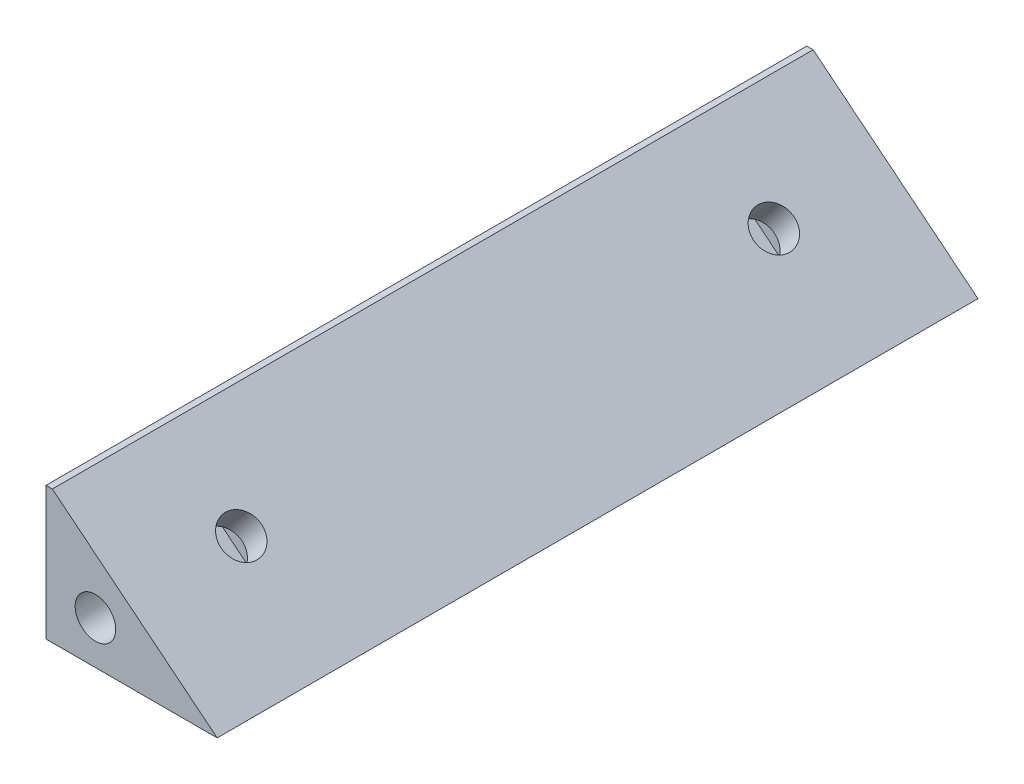
ISO-10303-21;
HEADER;
FILE_DESCRIPTION(('STEP AP214'),'2;1');
FILE_NAME('part.step','',(''),(''),'','','');
FILE_SCHEMA(('AUTOMOTIVE_DESIGN { 1 0 10303 214 1 1 1 1 }'));
ENDSEC;
DATA;
#1=APPLICATION_CONTEXT('core data for automotive mechanical design processes');
#2=APPLICATION_PROTOCOL_DEFINITION('international standard','automotive_design',2000,#1);
#3=PRODUCT_CONTEXT('',#1,'mechanical');
#4=PRODUCT('Part','Part','',(#3));
#5=PRODUCT_RELATED_PRODUCT_CATEGORY('part','',(#4));
#6=PRODUCT_DEFINITION_FORMATION('','',#4);
#7=PRODUCT_DEFINITION_CONTEXT('part definition',#1,'design');
#8=PRODUCT_DEFINITION('design','',#6,#7);
#9=PRODUCT_DEFINITION_SHAPE('','',#8);
#10=(LENGTH_UNIT() NAMED_UNIT(*) SI_UNIT(.MILLI.,.METRE.));
#11=(NAMED_UNIT(*) PLANE_ANGLE_UNIT() SI_UNIT($,.RADIAN.));
#12=(NAMED_UNIT(*) SI_UNIT($,.STERADIAN.) SOLID_ANGLE_UNIT());
#13=UNCERTAINTY_MEASURE_WITH_UNIT(LENGTH_MEASURE(1.E-05),#10,'distance_accuracy_value','');
#14=(GEOMETRIC_REPRESENTATION_CONTEXT(3) GLOBAL_UNCERTAINTY_ASSIGNED_CONTEXT((#13)) GLOBAL_UNIT_ASSIGNED_CONTEXT((#10,
#11,#12)) REPRESENTATION_CONTEXT('',''));
#15=CARTESIAN_POINT('',(0.,0.,0.));
#16=DIRECTION('',(0.,0.,1.));
#17=DIRECTION('',(1.,0.,0.));
#18=AXIS2_PLACEMENT_3D('',#15,#16,#17);
#19=CARTESIAN_POINT('',(3.59307184949746,4.44856514699686,0.));
#20=DIRECTION('',(0.628337107087621,0.777941180203721,0.));
#21=DIRECTION('',(-0.777941180203721,0.628337107087621,0.));
#22=AXIS2_PLACEMENT_3D('',#19,#20,#21);
#23=PLANE('',#22);
#24=CARTESIAN_POINT('',(4.35956280460536,3.82947629864048,9.));
#25=DIRECTION('',(0.628337107087621,0.777941180203721,0.));
#26=DIRECTION('',(-0.777941180203721,0.628337107087621,0.));
#27=AXIS2_PLACEMENT_3D('',#24,#25,#26);
#28=CIRCLE('',#27,1.6);
#29=CARTESIAN_POINT('',(3.11485691627941,4.83481566998067,9.));
#30=VERTEX_POINT('',#29);
#31=EDGE_CURVE('E419',#30,#30,#28,.T.);
#32=ORIENTED_EDGE('',*,*,#31,.T.);
#33=EDGE_LOOP('',(#32));
#34=FACE_BOUND('',#33,.T.);
#35=DIRECTION('',(0.777941180203722,-0.628337107087621,0.));
#36=VECTOR('',#35,1.);
#37=CARTESIAN_POINT('',(3.59307184949746,4.44856514699686,6.175));
#38=LINE('',#37,#36);
#39=CARTESIAN_POINT('',(3.09072945140817,4.85430323776128,6.175));
#40=VERTEX_POINT('',#39);
#41=CARTESIAN_POINT('',(9.10081917435071,0.,6.175));
#42=VERTEX_POINT('',#41);
#43=EDGE_CURVE('E415',#40,#42,#38,.T.);
#44=ORIENTED_EDGE('',*,*,#43,.T.);
#45=DIRECTION('',(0.,0.,1.));
#46=VECTOR('',#45,1.);
#47=CARTESIAN_POINT('',(9.10081917435071,0.,0.));
#48=LINE('',#47,#46);
#49=CARTESIAN_POINT('',(9.10081917435071,0.,11.825));
#50=VERTEX_POINT('',#49);
#51=EDGE_CURVE('E634',#42,#50,#48,.T.);
#52=ORIENTED_EDGE('',*,*,#51,.T.);
#53=DIRECTION('',(-0.777941180203721,0.628337107087621,0.));
#54=VECTOR('',#53,1.);
#55=CARTESIAN_POINT('',(3.59307184949746,4.44856514699686,11.825));
#56=LINE('',#55,#54);
#57=CARTESIAN_POINT('',(3.09072945140817,4.85430323776128,11.825));
#58=VERTEX_POINT('',#57);
#59=EDGE_CURVE('E430',#50,#58,#56,.T.);
#60=ORIENTED_EDGE('',*,*,#59,.T.);
#61=DIRECTION('',(-0.388970590101861,0.314168553543811,-0.866025403784439));
#62=VECTOR('',#61,1.);
#63=CARTESIAN_POINT('',(-0.767035675146511,7.97019045536314,3.23586065001688));
#64=LINE('',#63,#62);
#65=CARTESIAN_POINT('',(1.82189609821099,5.87913017688208,9.));
#66=VERTEX_POINT('',#65);
#67=EDGE_CURVE('E423',#58,#66,#64,.T.);
#68=ORIENTED_EDGE('',*,*,#67,.T.);
#69=DIRECTION('',(0.388970590101861,-0.314168553543811,-0.866025403784439));
#70=VECTOR('',#69,1.);
#71=CARTESIAN_POINT('',(5.29641574721172,3.07278738345842,1.26413934998312));
#72=LINE('',#71,#70);
#73=EDGE_CURVE('E493',#66,#40,#72,.T.);
#74=ORIENTED_EDGE('',*,*,#73,.T.);
#75=EDGE_LOOP('',(#44,#52,#60,#68,#74));
#76=FACE_BOUND('',#75,.T.);
#77=ADVANCED_FACE('F135',(#34,#76),#23,.F.);
#78=CARTESIAN_POINT('',(0.,0.,30.));
#79=DIRECTION('',(0.,1.,0.));
#80=DIRECTION('',(-1.,0.,0.));
#81=AXIS2_PLACEMENT_3D('',#78,#79,#80);
#82=PLANE('',#81);
#83=DIRECTION('',(1.,0.,0.));
#84=VECTOR('',#83,1.);
#85=CARTESIAN_POINT('',(0.,0.,0.));
#86=LINE('',#85,#84);
#87=CARTESIAN_POINT('',(-0.5,0.,0.));
#88=VERTEX_POINT('',#87);
#89=CARTESIAN_POINT('',(13.,0.,0.));
#90=VERTEX_POINT('',#89);
#91=EDGE_CURVE('E329',#88,#90,#86,.T.);
#92=ORIENTED_EDGE('',*,*,#91,.T.);
#93=DIRECTION('',(0.,0.,-1.));
#94=VECTOR('',#93,1.);
#95=CARTESIAN_POINT('',(13.,0.,30.));
#96=LINE('',#95,#94);
#97=CARTESIAN_POINT('',(13.,0.,60.));
#98=VERTEX_POINT('',#97);
#99=EDGE_CURVE('E327',#98,#90,#96,.T.);
#100=ORIENTED_EDGE('',*,*,#99,.F.);
#101=DIRECTION('',(1.,0.,0.));
#102=VECTOR('',#101,1.);
#103=CARTESIAN_POINT('',(0.,0.,60.));
#104=LINE('',#103,#102);
#105=CARTESIAN_POINT('',(-0.5,0.,60.));
#106=VERTEX_POINT('',#105);
#107=EDGE_CURVE('E311',#106,#98,#104,.T.);
#108=ORIENTED_EDGE('',*,*,#107,.F.);
#109=DIRECTION('',(0.,0.,-1.));
#110=VECTOR('',#109,1.);
#111=CARTESIAN_POINT('',(-0.5,0.,30.));
#112=LINE('',#111,#110);
#113=EDGE_CURVE('E481',#106,#88,#112,.T.);
#114=ORIENTED_EDGE('',*,*,#113,.T.);
#115=EDGE_LOOP('',(#92,#100,#108,#114));
#116=FACE_BOUND('',#115,.T.);
#117=DIRECTION('',(1.,0.,0.));
#118=VECTOR('',#117,1.);
#119=CARTESIAN_POINT('',(0.,0.,11.825));
#120=LINE('',#119,#118);
#121=CARTESIAN_POINT('',(5.04248811091981,0.,11.825));
#122=VERTEX_POINT('',#121);
#123=EDGE_CURVE('E455',#122,#50,#120,.T.);
#124=ORIENTED_EDGE('',*,*,#123,.T.);
#125=ORIENTED_EDGE('',*,*,#51,.F.);
#126=DIRECTION('',(1.,0.,0.));
#127=VECTOR('',#126,1.);
#128=CARTESIAN_POINT('',(0.,0.,6.175));
#129=LINE('',#128,#127);
#130=CARTESIAN_POINT('',(5.04248811091981,0.,6.175));
#131=VERTEX_POINT('',#130);
#132=EDGE_CURVE('E466',#131,#42,#129,.T.);
#133=ORIENTED_EDGE('',*,*,#132,.F.);
#134=DIRECTION('',(0.,0.,-1.));
#135=VECTOR('',#134,1.);
#136=CARTESIAN_POINT('',(5.04248811091981,0.,30.));
#137=LINE('',#136,#135);
#138=EDGE_CURVE('E333',#122,#131,#137,.T.);
#139=ORIENTED_EDGE('',*,*,#138,.F.);
#140=EDGE_LOOP('',(#124,#125,#133,#139));
#141=FACE_BOUND('',#140,.T.);
#142=CARTESIAN_POINT('',(9.10081917435071,0.,48.175));
#143=VERTEX_POINT('',#142);
#144=CARTESIAN_POINT('',(9.10081917435071,0.,53.825));
#145=VERTEX_POINT('',#144);
#146=EDGE_CURVE('E523',#143,#145,#48,.T.);
#147=ORIENTED_EDGE('',*,*,#146,.F.);
#148=DIRECTION('',(1.,0.,0.));
#149=VECTOR('',#148,1.);
#150=CARTESIAN_POINT('',(0.,0.,48.175));
#151=LINE('',#150,#149);
#152=CARTESIAN_POINT('',(5.04248811091981,0.,48.175));
#153=VERTEX_POINT('',#152);
#154=EDGE_CURVE('E516',#153,#143,#151,.T.);
#155=ORIENTED_EDGE('',*,*,#154,.F.);
#156=DIRECTION('',(0.,0.,-1.));
#157=VECTOR('',#156,1.);
#158=CARTESIAN_POINT('',(5.04248811091981,0.,30.));
#159=LINE('',#158,#157);
#160=CARTESIAN_POINT('',(5.04248811091981,0.,53.825));
#161=VERTEX_POINT('',#160);
#162=EDGE_CURVE('E144',#161,#153,#159,.T.);
#163=ORIENTED_EDGE('',*,*,#162,.F.);
#164=DIRECTION('',(1.,0.,0.));
#165=VECTOR('',#164,1.);
#166=CARTESIAN_POINT('',(0.,0.,53.825));
#167=LINE('',#166,#165);
#168=EDGE_CURVE('E526',#161,#145,#167,.T.);
#169=ORIENTED_EDGE('',*,*,#168,.T.);
#170=EDGE_LOOP('',(#147,#155,#163,#169));
#171=FACE_BOUND('',#170,.T.);
#172=DIRECTION('',(0.,0.,-1.));
#173=VECTOR('',#172,1.);
#174=CARTESIAN_POINT('',(9.15,0.,5.));
#175=LINE('',#174,#173);
#176=CARTESIAN_POINT('',(9.15,0.,5.));
#177=VERTEX_POINT('',#176);
#178=CARTESIAN_POINT('',(9.15,0.,2.45));
#179=VERTEX_POINT('',#178);
#180=EDGE_CURVE('E406',#177,#179,#175,.T.);
#181=ORIENTED_EDGE('',*,*,#180,.T.);
#182=DIRECTION('',(1.,0.,0.));
#183=VECTOR('',#182,1.);
#184=CARTESIAN_POINT('',(0.,0.,2.45));
#185=LINE('',#184,#183);
#186=CARTESIAN_POINT('',(3.11352959219352,0.,2.45));
#187=VERTEX_POINT('',#186);
#188=EDGE_CURVE('E355',#187,#179,#185,.T.);
#189=ORIENTED_EDGE('',*,*,#188,.F.);
#190=DIRECTION('',(0.,0.,-1.));
#191=VECTOR('',#190,1.);
#192=CARTESIAN_POINT('',(3.11352959219352,0.,5.));
#193=LINE('',#192,#191);
#194=CARTESIAN_POINT('',(3.11352959219352,0.,5.));
#195=VERTEX_POINT('',#194);
#196=EDGE_CURVE('E410',#195,#187,#193,.T.);
#197=ORIENTED_EDGE('',*,*,#196,.F.);
#198=DIRECTION('',(1.,0.,0.));
#199=VECTOR('',#198,1.);
#200=CARTESIAN_POINT('',(0.,0.,5.));
#201=LINE('',#200,#199);
#202=EDGE_CURVE('E374',#195,#177,#201,.T.);
#203=ORIENTED_EDGE('',*,*,#202,.T.);
#204=EDGE_LOOP('',(#181,#189,#197,#203));
#205=FACE_BOUND('',#204,.T.);
#206=DIRECTION('',(1.,0.,0.));
#207=VECTOR('',#206,1.);
#208=CARTESIAN_POINT('',(0.,0.,55.));
#209=LINE('',#208,#207);
#210=CARTESIAN_POINT('',(3.11352959219352,0.,55.));
#211=VERTEX_POINT('',#210);
#212=CARTESIAN_POINT('',(9.15,0.,55.));
#213=VERTEX_POINT('',#212);
#214=EDGE_CURVE('E683',#211,#213,#209,.T.);
#215=ORIENTED_EDGE('',*,*,#214,.F.);
#216=DIRECTION('',(0.,0.,1.));
#217=VECTOR('',#216,1.);
#218=CARTESIAN_POINT('',(3.11352959219352,0.,55.));
#219=LINE('',#218,#217);
#220=CARTESIAN_POINT('',(3.11352959219352,0.,57.55));
#221=VERTEX_POINT('',#220);
#222=EDGE_CURVE('E687',#211,#221,#219,.T.);
#223=ORIENTED_EDGE('',*,*,#222,.T.);
#224=DIRECTION('',(1.,0.,0.));
#225=VECTOR('',#224,1.);
#226=CARTESIAN_POINT('',(0.,0.,57.55));
#227=LINE('',#226,#225);
#228=CARTESIAN_POINT('',(9.15,0.,57.55));
#229=VERTEX_POINT('',#228);
#230=EDGE_CURVE('E656',#221,#229,#227,.T.);
#231=ORIENTED_EDGE('',*,*,#230,.T.);
#232=DIRECTION('',(0.,0.,1.));
#233=VECTOR('',#232,1.);
#234=CARTESIAN_POINT('',(9.15,0.,55.));
#235=LINE('',#234,#233);
#236=EDGE_CURVE('E690',#213,#229,#235,.T.);
#237=ORIENTED_EDGE('',*,*,#236,.F.);
#238=EDGE_LOOP('',(#215,#223,#231,#237));
#239=FACE_BOUND('',#238,.T.);
#240=ADVANCED_FACE('F137',(#116,#141,#171,#205,#239),#82,.F.);
#241=CARTESIAN_POINT('',(1.99081222642403,2.46481513747737,48.175));
#242=DIRECTION('',(0.,0.,1.));
#243=DIRECTION('',(1.,0.,0.));
#244=AXIS2_PLACEMENT_3D('',#241,#242,#243);
#245=PLANE('',#244);
#246=ORIENTED_EDGE('',*,*,#154,.T.);
#247=DIRECTION('',(-0.777941180203721,0.628337107087621,0.));
#248=VECTOR('',#247,1.);
#249=CARTESIAN_POINT('',(3.59307184949746,4.44856514699686,48.175));
#250=LINE('',#249,#248);
#251=CARTESIAN_POINT('',(3.09072945140818,4.85430323776128,48.175));
#252=VERTEX_POINT('',#251);
#253=EDGE_CURVE('E586',#143,#252,#250,.T.);
#254=ORIENTED_EDGE('',*,*,#253,.T.);
#255=DIRECTION('',(0.628337107087621,0.777941180203721,0.));
#256=VECTOR('',#255,1.);
#257=CARTESIAN_POINT('',(1.48846982833474,2.87055322824179,48.175));
#258=LINE('',#257,#256);
#259=CARTESIAN_POINT('',(1.48846982833474,2.87055322824179,48.175));
#260=VERTEX_POINT('',#259);
#261=EDGE_CURVE('E518',#260,#252,#258,.T.);
#262=ORIENTED_EDGE('',*,*,#261,.F.);
#263=DIRECTION('',(0.777941180203721,-0.628337107087621,0.));
#264=VECTOR('',#263,1.);
#265=CARTESIAN_POINT('',(1.99081222642403,2.46481513747737,48.175));
#266=LINE('',#265,#264);
#267=EDGE_CURVE('E503',#260,#153,#266,.T.);
#268=ORIENTED_EDGE('',*,*,#267,.T.);
#269=EDGE_LOOP('',(#246,#254,#262,#268));
#270=FACE_BOUND('',#269,.T.);
#271=ADVANCED_FACE('F514',(#270),#245,.T.);
#272=CARTESIAN_POINT('',(1.99081222642403,2.46481513747737,53.825));
#273=DIRECTION('',(0.,0.,1.));
#274=DIRECTION('',(1.,0.,0.));
#275=AXIS2_PLACEMENT_3D('',#272,#273,#274);
#276=PLANE('',#275);
#277=DIRECTION('',(-0.777941180203721,0.628337107087621,0.));
#278=VECTOR('',#277,1.);
#279=CARTESIAN_POINT('',(3.59307184949746,4.44856514699686,53.825));
#280=LINE('',#279,#278);
#281=CARTESIAN_POINT('',(3.09072945140817,4.85430323776128,53.825));
#282=VERTEX_POINT('',#281);
#283=EDGE_CURVE('E598',#145,#282,#280,.T.);
#284=ORIENTED_EDGE('',*,*,#283,.F.);
#285=ORIENTED_EDGE('',*,*,#168,.F.);
#286=DIRECTION('',(0.777941180203722,-0.628337107087621,0.));
#287=VECTOR('',#286,1.);
#288=CARTESIAN_POINT('',(1.99081222642403,2.46481513747737,53.825));
#289=LINE('',#288,#287);
#290=CARTESIAN_POINT('',(1.48846982833474,2.87055322824179,53.825));
#291=VERTEX_POINT('',#290);
#292=EDGE_CURVE('E507',#291,#161,#289,.T.);
#293=ORIENTED_EDGE('',*,*,#292,.F.);
#294=DIRECTION('',(0.628337107087621,0.777941180203721,0.));
#295=VECTOR('',#294,1.);
#296=CARTESIAN_POINT('',(1.48846982833474,2.87055322824179,53.825));
#297=LINE('',#296,#295);
#298=EDGE_CURVE('E620',#291,#282,#297,.T.);
#299=ORIENTED_EDGE('',*,*,#298,.T.);
#300=EDGE_LOOP('',(#284,#285,#293,#299));
#301=FACE_BOUND('',#300,.T.);
#302=ADVANCED_FACE('F632',(#301),#276,.F.);
#303=CARTESIAN_POINT('',(-2.36929529821995,5.98644044584365,56.7641393499831));
#304=DIRECTION('',(0.673716824706471,-0.544155896878303,0.5));
#305=DIRECTION('',(0.628337107087621,0.777941180203721,0.));
#306=AXIS2_PLACEMENT_3D('',#303,#304,#305);
#307=PLANE('',#306);
#308=ORIENTED_EDGE('',*,*,#261,.T.);
#309=DIRECTION('',(-0.388970590101861,0.314168553543811,0.866025403784439));
#310=VECTOR('',#309,1.);
#311=CARTESIAN_POINT('',(-0.767035675146511,7.97019045536314,56.7641393499831));
#312=LINE('',#311,#310);
#313=CARTESIAN_POINT('',(1.82189609821098,5.87913017688209,51.));
#314=VERTEX_POINT('',#313);
#315=EDGE_CURVE('E592',#252,#314,#312,.T.);
#316=ORIENTED_EDGE('',*,*,#315,.T.);
#317=DIRECTION('',(0.628337107087621,0.777941180203721,0.));
#318=VECTOR('',#317,1.);
#319=CARTESIAN_POINT('',(0.219636475137554,3.8953801673626,51.));
#320=LINE('',#319,#318);
#321=CARTESIAN_POINT('',(0.219636475137554,3.8953801673626,51.));
#322=VERTEX_POINT('',#321);
#323=EDGE_CURVE('E520',#322,#314,#320,.T.);
#324=ORIENTED_EDGE('',*,*,#323,.F.);
#325=DIRECTION('',(0.388970590101861,-0.314168553543811,-0.866025403784439));
#326=VECTOR('',#325,1.);
#327=CARTESIAN_POINT('',(-2.36929529821995,5.98644044584365,56.7641393499831));
#328=LINE('',#327,#326);
#329=EDGE_CURVE('E610',#322,#260,#328,.T.);
#330=ORIENTED_EDGE('',*,*,#329,.T.);
#331=EDGE_LOOP('',(#308,#316,#324,#330));
#332=FACE_BOUND('',#331,.T.);
#333=ADVANCED_FACE('F629',(#332),#307,.T.);
#334=CARTESIAN_POINT('',(3.69415612413829,1.08903737393893,58.7358606500169));
#335=DIRECTION('',(0.673716824706471,-0.544155896878303,-0.5));
#336=DIRECTION('',(0.628337107087621,0.777941180203721,0.));
#337=AXIS2_PLACEMENT_3D('',#334,#335,#336);
#338=PLANE('',#337);
#339=ORIENTED_EDGE('',*,*,#323,.T.);
#340=DIRECTION('',(0.388970590101861,-0.314168553543811,0.866025403784439));
#341=VECTOR('',#340,1.);
#342=CARTESIAN_POINT('',(5.29641574721172,3.07278738345842,58.7358606500169));
#343=LINE('',#342,#341);
#344=EDGE_CURVE('E12',#314,#282,#343,.T.);
#345=ORIENTED_EDGE('',*,*,#344,.T.);
#346=ORIENTED_EDGE('',*,*,#298,.F.);
#347=DIRECTION('',(-0.388970590101861,0.314168553543811,-0.866025403784439));
#348=VECTOR('',#347,1.);
#349=CARTESIAN_POINT('',(3.69415612413829,1.08903737393893,58.7358606500169));
#350=LINE('',#349,#348);
#351=EDGE_CURVE('E613',#291,#322,#350,.T.);
#352=ORIENTED_EDGE('',*,*,#351,.T.);
#353=EDGE_LOOP('',(#339,#345,#346,#352));
#354=FACE_BOUND('',#353,.T.);
#355=ADVANCED_FACE('F627',(#354),#338,.T.);
#356=CARTESIAN_POINT('',(5.13249776186213,6.35452103849597,30.));
#357=DIRECTION('',(0.628337107087621,0.777941180203721,0.));
#358=DIRECTION('',(-0.777941180203721,0.628337107087621,0.));
#359=AXIS2_PLACEMENT_3D('',#356,#357,#358);
#360=PLANE('',#359);
#361=DIRECTION('',(0.777941180203721,-0.628337107087621,0.));
#362=VECTOR('',#361,1.);
#363=CARTESIAN_POINT('',(5.13249776186213,6.35452103849597,60.));
#364=LINE('',#363,#362);
#365=CARTESIAN_POINT('',(0.,10.5,60.));
#366=VERTEX_POINT('',#365);
#367=EDGE_CURVE('E317',#366,#98,#364,.T.);
#368=ORIENTED_EDGE('',*,*,#367,.T.);
#369=ORIENTED_EDGE('',*,*,#99,.T.);
#370=DIRECTION('',(0.777941180203721,-0.628337107087621,0.));
#371=VECTOR('',#370,1.);
#372=CARTESIAN_POINT('',(5.13249776186213,6.35452103849597,0.));
#373=LINE('',#372,#371);
#374=CARTESIAN_POINT('',(0.,10.5,0.));
#375=VERTEX_POINT('',#374);
#376=EDGE_CURVE('E486',#375,#90,#373,.T.);
#377=ORIENTED_EDGE('',*,*,#376,.F.);
#378=DIRECTION('',(0.,0.,-1.));
#379=VECTOR('',#378,1.);
#380=CARTESIAN_POINT('',(0.,10.5,30.));
#381=LINE('',#380,#379);
#382=EDGE_CURVE('E334',#366,#375,#381,.T.);
#383=ORIENTED_EDGE('',*,*,#382,.F.);
#384=EDGE_LOOP('',(#368,#369,#377,#383));
#385=FACE_BOUND('',#384,.T.);
#386=CARTESIAN_POINT('',(5.89898871697003,5.7354321901396,9.));
#387=DIRECTION('',(0.628337107087621,0.777941180203721,0.));
#388=DIRECTION('',(-0.777941180203721,0.628337107087621,0.));
#389=AXIS2_PLACEMENT_3D('',#386,#387,#388);
#390=CIRCLE('',#389,1.6);
#391=CARTESIAN_POINT('',(4.65428282864408,6.74077156147979,9.));
#392=VERTEX_POINT('',#391);
#393=EDGE_CURVE('E414',#392,#392,#390,.T.);
#394=ORIENTED_EDGE('',*,*,#393,.F.);
#395=EDGE_LOOP('',(#394));
#396=FACE_BOUND('',#395,.T.);
#397=CARTESIAN_POINT('',(5.89898871697003,5.7354321901396,51.));
#398=DIRECTION('',(-0.628337107087621,-0.777941180203721,0.));
#399=DIRECTION('',(-0.777941180203721,0.628337107087621,0.));
#400=AXIS2_PLACEMENT_3D('',#397,#398,#399);
#401=CIRCLE('',#400,1.6);
#402=CARTESIAN_POINT('',(4.65428282864408,6.74077156147979,51.));
#403=VERTEX_POINT('',#402);
#404=EDGE_CURVE('E593',#403,#403,#401,.T.);
#405=ORIENTED_EDGE('',*,*,#404,.T.);
#406=EDGE_LOOP('',(#405));
#407=FACE_BOUND('',#406,.T.);
#408=ADVANCED_FACE('F336',(#385,#396,#407),#360,.T.);
#409=CARTESIAN_POINT('',(0.,0.,0.));
#410=DIRECTION('',(0.,0.,1.));
#411=DIRECTION('',(1.,0.,0.));
#412=AXIS2_PLACEMENT_3D('',#409,#410,#411);
#413=PLANE('',#412);
#414=ORIENTED_EDGE('',*,*,#376,.T.);
#415=ORIENTED_EDGE('',*,*,#91,.F.);
#416=DIRECTION('',(0.,1.,0.));
#417=VECTOR('',#416,1.);
#418=CARTESIAN_POINT('',(-0.5,0.,0.));
#419=LINE('',#418,#417);
#420=CARTESIAN_POINT('',(-0.5,10.5,0.));
#421=VERTEX_POINT('',#420);
#422=EDGE_CURVE('E470',#88,#421,#419,.T.);
#423=ORIENTED_EDGE('',*,*,#422,.T.);
#424=DIRECTION('',(-1.,0.,0.));
#425=VECTOR('',#424,1.);
#426=CARTESIAN_POINT('',(0.,10.5,0.));
#427=LINE('',#426,#425);
#428=EDGE_CURVE('E474',#375,#421,#427,.T.);
#429=ORIENTED_EDGE('',*,*,#428,.F.);
#430=EDGE_LOOP('',(#414,#415,#423,#429));
#431=FACE_BOUND('',#430,.T.);
#432=CARTESIAN_POINT('',(3.4,3.4,0.));
#433=DIRECTION('',(0.,0.,1.));
#434=DIRECTION('',(1.,0.,0.));
#435=AXIS2_PLACEMENT_3D('',#432,#433,#434);
#436=CIRCLE('',#435,1.6);
#437=CARTESIAN_POINT('',(5.,3.4,0.));
#438=VERTEX_POINT('',#437);
#439=EDGE_CURVE('E340',#438,#438,#436,.T.);
#440=ORIENTED_EDGE('',*,*,#439,.T.);
#441=EDGE_LOOP('',(#440));
#442=FACE_BOUND('',#441,.T.);
#443=ADVANCED_FACE('F541',(#431,#442),#413,.F.);
#444=CARTESIAN_POINT('',(1.99081222642403,2.46481513747737,6.175));
#445=DIRECTION('',(0.,0.,1.));
#446=DIRECTION('',(1.,0.,0.));
#447=AXIS2_PLACEMENT_3D('',#444,#445,#446);
#448=PLANE('',#447);
#449=ORIENTED_EDGE('',*,*,#132,.T.);
#450=ORIENTED_EDGE('',*,*,#43,.F.);
#451=DIRECTION('',(0.628337107087621,0.777941180203721,0.));
#452=VECTOR('',#451,1.);
#453=CARTESIAN_POINT('',(1.48846982833474,2.87055322824179,6.175));
#454=LINE('',#453,#452);
#455=CARTESIAN_POINT('',(1.48846982833474,2.87055322824179,6.175));
#456=VERTEX_POINT('',#455);
#457=EDGE_CURVE('E456',#456,#40,#454,.T.);
#458=ORIENTED_EDGE('',*,*,#457,.F.);
#459=DIRECTION('',(0.777941180203722,-0.628337107087621,0.));
#460=VECTOR('',#459,1.);
#461=CARTESIAN_POINT('',(1.99081222642403,2.46481513747737,6.175));
#462=LINE('',#461,#460);
#463=EDGE_CURVE('E442',#456,#131,#462,.T.);
#464=ORIENTED_EDGE('',*,*,#463,.T.);
#465=EDGE_LOOP('',(#449,#450,#458,#464));
#466=FACE_BOUND('',#465,.T.);
#467=ADVANCED_FACE('F544',(#466),#448,.T.);
#468=CARTESIAN_POINT('',(1.99081222642403,2.46481513747737,11.825));
#469=DIRECTION('',(0.,0.,1.));
#470=DIRECTION('',(1.,0.,0.));
#471=AXIS2_PLACEMENT_3D('',#468,#469,#470);
#472=PLANE('',#471);
#473=ORIENTED_EDGE('',*,*,#59,.F.);
#474=ORIENTED_EDGE('',*,*,#123,.F.);
#475=DIRECTION('',(0.777941180203721,-0.628337107087621,0.));
#476=VECTOR('',#475,1.);
#477=CARTESIAN_POINT('',(1.99081222642403,2.46481513747737,11.825));
#478=LINE('',#477,#476);
#479=CARTESIAN_POINT('',(1.48846982833474,2.87055322824179,11.825));
#480=VERTEX_POINT('',#479);
#481=EDGE_CURVE('E438',#480,#122,#478,.T.);
#482=ORIENTED_EDGE('',*,*,#481,.F.);
#483=DIRECTION('',(0.628337107087621,0.777941180203721,0.));
#484=VECTOR('',#483,1.);
#485=CARTESIAN_POINT('',(1.48846982833474,2.87055322824179,11.825));
#486=LINE('',#485,#484);
#487=EDGE_CURVE('E450',#480,#58,#486,.T.);
#488=ORIENTED_EDGE('',*,*,#487,.T.);
#489=EDGE_LOOP('',(#473,#474,#482,#488));
#490=FACE_BOUND('',#489,.T.);
#491=ADVANCED_FACE('F881',(#490),#472,.F.);
#492=CARTESIAN_POINT('',(-2.36929529821995,5.98644044584365,3.23586065001688));
#493=DIRECTION('',(-0.673716824706471,0.544155896878303,0.5));
#494=DIRECTION('',(-0.628337107087621,-0.777941180203721,0.));
#495=AXIS2_PLACEMENT_3D('',#492,#493,#494);
#496=PLANE('',#495);
#497=ORIENTED_EDGE('',*,*,#67,.F.);
#498=ORIENTED_EDGE('',*,*,#487,.F.);
#499=DIRECTION('',(0.388970590101861,-0.314168553543811,0.866025403784439));
#500=VECTOR('',#499,1.);
#501=CARTESIAN_POINT('',(-2.36929529821995,5.98644044584365,3.23586065001688));
#502=LINE('',#501,#500);
#503=CARTESIAN_POINT('',(0.219636475137554,3.8953801673626,9.));
#504=VERTEX_POINT('',#503);
#505=EDGE_CURVE('E434',#504,#480,#502,.T.);
#506=ORIENTED_EDGE('',*,*,#505,.F.);
#507=DIRECTION('',(0.628337107087621,0.777941180203721,0.));
#508=VECTOR('',#507,1.);
#509=CARTESIAN_POINT('',(0.219636475137554,3.8953801673626,9.));
#510=LINE('',#509,#508);
#511=EDGE_CURVE('E451',#504,#66,#510,.T.);
#512=ORIENTED_EDGE('',*,*,#511,.T.);
#513=EDGE_LOOP('',(#497,#498,#506,#512));
#514=FACE_BOUND('',#513,.T.);
#515=ADVANCED_FACE('F891',(#514),#496,.F.);
#516=CARTESIAN_POINT('',(3.69415612413829,1.08903737393893,1.26413934998312));
#517=DIRECTION('',(-0.673716824706471,0.544155896878303,-0.5));
#518=DIRECTION('',(-0.628337107087621,-0.777941180203721,0.));
#519=AXIS2_PLACEMENT_3D('',#516,#517,#518);
#520=PLANE('',#519);
#521=ORIENTED_EDGE('',*,*,#73,.F.);
#522=ORIENTED_EDGE('',*,*,#511,.F.);
#523=DIRECTION('',(-0.388970590101861,0.314168553543811,0.866025403784439));
#524=VECTOR('',#523,1.);
#525=CARTESIAN_POINT('',(3.69415612413829,1.08903737393893,1.26413934998312));
#526=LINE('',#525,#524);
#527=EDGE_CURVE('E446',#456,#504,#526,.T.);
#528=ORIENTED_EDGE('',*,*,#527,.F.);
#529=ORIENTED_EDGE('',*,*,#457,.T.);
#530=EDGE_LOOP('',(#521,#522,#528,#529));
#531=FACE_BOUND('',#530,.T.);
#532=ADVANCED_FACE('F1115',(#531),#520,.F.);
#533=CARTESIAN_POINT('',(-0.5,0.,30.));
#534=DIRECTION('',(-1.,0.,0.));
#535=DIRECTION('',(0.,0.,1.));
#536=AXIS2_PLACEMENT_3D('',#533,#534,#535);
#537=PLANE('',#536);
#538=ORIENTED_EDGE('',*,*,#422,.F.);
#539=ORIENTED_EDGE('',*,*,#113,.F.);
#540=DIRECTION('',(0.,1.,0.));
#541=VECTOR('',#540,1.);
#542=CARTESIAN_POINT('',(-0.5,0.,60.));
#543=LINE('',#542,#541);
#544=CARTESIAN_POINT('',(-0.5,10.5,60.));
#545=VERTEX_POINT('',#544);
#546=EDGE_CURVE('E320',#106,#545,#543,.T.);
#547=ORIENTED_EDGE('',*,*,#546,.T.);
#548=DIRECTION('',(0.,0.,-1.));
#549=VECTOR('',#548,1.);
#550=CARTESIAN_POINT('',(-0.5,10.5,30.));
#551=LINE('',#550,#549);
#552=EDGE_CURVE('E478',#545,#421,#551,.T.);
#553=ORIENTED_EDGE('',*,*,#552,.T.);
#554=EDGE_LOOP('',(#538,#539,#547,#553));
#555=FACE_BOUND('',#554,.T.);
#556=ADVANCED_FACE('F539',(#555),#537,.T.);
#557=CARTESIAN_POINT('',(0.,10.5,30.));
#558=DIRECTION('',(0.,-1.,0.));
#559=DIRECTION('',(0.,0.,-1.));
#560=AXIS2_PLACEMENT_3D('',#557,#558,#559);
#561=PLANE('',#560);
#562=ORIENTED_EDGE('',*,*,#428,.T.);
#563=ORIENTED_EDGE('',*,*,#552,.F.);
#564=DIRECTION('',(-1.,0.,0.));
#565=VECTOR('',#564,1.);
#566=CARTESIAN_POINT('',(0.,10.5,60.));
#567=LINE('',#566,#565);
#568=EDGE_CURVE('E324',#366,#545,#567,.T.);
#569=ORIENTED_EDGE('',*,*,#568,.F.);
#570=ORIENTED_EDGE('',*,*,#382,.T.);
#571=EDGE_LOOP('',(#562,#563,#569,#570));
#572=FACE_BOUND('',#571,.T.);
#573=ADVANCED_FACE('F535',(#572),#561,.F.);
#574=CARTESIAN_POINT('',(1.99081222642403,2.46481513747737,0.));
#575=DIRECTION('',(0.628337107087621,0.777941180203721,0.));
#576=DIRECTION('',(-0.777941180203721,0.628337107087621,0.));
#577=AXIS2_PLACEMENT_3D('',#574,#575,#576);
#578=PLANE('',#577);
#579=ORIENTED_EDGE('',*,*,#138,.T.);
#580=ORIENTED_EDGE('',*,*,#463,.F.);
#581=ORIENTED_EDGE('',*,*,#527,.T.);
#582=ORIENTED_EDGE('',*,*,#505,.T.);
#583=ORIENTED_EDGE('',*,*,#481,.T.);
#584=EDGE_LOOP('',(#579,#580,#581,#582,#583));
#585=FACE_BOUND('',#584,.T.);
#586=ADVANCED_FACE('F575',(#585),#578,.T.);
#587=ORIENTED_EDGE('',*,*,#253,.F.);
#588=ORIENTED_EDGE('',*,*,#146,.T.);
#589=ORIENTED_EDGE('',*,*,#283,.T.);
#590=ORIENTED_EDGE('',*,*,#344,.F.);
#591=ORIENTED_EDGE('',*,*,#315,.F.);
#592=EDGE_LOOP('',(#587,#588,#589,#590,#591));
#593=FACE_BOUND('',#592,.T.);
#594=CARTESIAN_POINT('',(4.35956280460536,3.82947629864048,51.));
#595=DIRECTION('',(-0.628337107087621,-0.777941180203721,0.));
#596=DIRECTION('',(-0.777941180203721,0.628337107087621,0.));
#597=AXIS2_PLACEMENT_3D('',#594,#595,#596);
#598=CIRCLE('',#597,1.6);
#599=CARTESIAN_POINT('',(3.11485691627941,4.83481566998067,51.));
#600=VERTEX_POINT('',#599);
#601=EDGE_CURVE('E589',#600,#600,#598,.T.);
#602=ORIENTED_EDGE('',*,*,#601,.F.);
#603=EDGE_LOOP('',(#602));
#604=FACE_BOUND('',#603,.T.);
#605=ADVANCED_FACE('F566',(#593,#604),#23,.F.);
#606=CARTESIAN_POINT('',(4.35956280460536,3.82947629864048,9.));
#607=DIRECTION('',(0.628337107087621,0.777941180203722,0.));
#608=DIRECTION('',(-0.777941180203721,0.628337107087621,0.));
#609=AXIS2_PLACEMENT_3D('',#606,#607,#608);
#610=CYLINDRICAL_SURFACE('',#609,1.6);
#611=ORIENTED_EDGE('',*,*,#31,.F.);
#612=EDGE_LOOP('',(#611));
#613=FACE_BOUND('',#612,.T.);
#614=ORIENTED_EDGE('',*,*,#393,.T.);
#615=EDGE_LOOP('',(#614));
#616=FACE_BOUND('',#615,.T.);
#617=ADVANCED_FACE('F574',(#613,#616),#610,.F.);
#618=CARTESIAN_POINT('',(9.15,0.,5.));
#619=DIRECTION('',(-1.,0.,0.));
#620=DIRECTION('',(0.,0.,1.));
#621=AXIS2_PLACEMENT_3D('',#618,#619,#620);
#622=PLANE('',#621);
#623=DIRECTION('',(0.,1.,0.));
#624=VECTOR('',#623,1.);
#625=CARTESIAN_POINT('',(9.15,0.,2.45));
#626=LINE('',#625,#624);
#627=CARTESIAN_POINT('',(9.15,2.38714917553603,2.45));
#628=VERTEX_POINT('',#627);
#629=EDGE_CURVE('E358',#179,#628,#626,.T.);
#630=ORIENTED_EDGE('',*,*,#629,.F.);
#631=ORIENTED_EDGE('',*,*,#180,.F.);
#632=DIRECTION('',(0.,1.,0.));
#633=VECTOR('',#632,1.);
#634=CARTESIAN_POINT('',(9.15,0.,5.));
#635=LINE('',#634,#633);
#636=CARTESIAN_POINT('',(9.15,2.38714917553603,5.));
#637=VERTEX_POINT('',#636);
#638=EDGE_CURVE('E378',#177,#637,#635,.T.);
#639=ORIENTED_EDGE('',*,*,#638,.T.);
#640=DIRECTION('',(0.,0.,-1.));
#641=VECTOR('',#640,1.);
#642=CARTESIAN_POINT('',(9.15,2.38714917553603,5.));
#643=LINE('',#642,#641);
#644=EDGE_CURVE('E402',#637,#628,#643,.T.);
#645=ORIENTED_EDGE('',*,*,#644,.T.);
#646=EDGE_LOOP('',(#630,#631,#639,#645));
#647=FACE_BOUND('',#646,.T.);
#648=ADVANCED_FACE('F581',(#647),#622,.T.);
#649=CARTESIAN_POINT('',(4.77934955223153,5.91728992181055,5.));
#650=DIRECTION('',(-0.628337107087616,-0.777941180203726,0.));
#651=DIRECTION('',(0.777941180203726,-0.628337107087616,0.));
#652=AXIS2_PLACEMENT_3D('',#649,#650,#651);
#653=PLANE('',#652);
#654=DIRECTION('',(-0.777941180203726,0.628337107087616,0.));
#655=VECTOR('',#654,1.);
#656=CARTESIAN_POINT('',(4.77934955223153,5.91728992181055,2.45));
#657=LINE('',#656,#655);
#658=CARTESIAN_POINT('',(3.90621897432532,6.62251077319632,2.45));
#659=VERTEX_POINT('',#658);
#660=EDGE_CURVE('E361',#628,#659,#657,.T.);
#661=ORIENTED_EDGE('',*,*,#660,.F.);
#662=ORIENTED_EDGE('',*,*,#644,.F.);
#663=DIRECTION('',(-0.777941180203726,0.628337107087616,0.));
#664=VECTOR('',#663,1.);
#665=CARTESIAN_POINT('',(4.77934955223153,5.91728992181055,5.));
#666=LINE('',#665,#664);
#667=CARTESIAN_POINT('',(3.90621897432532,6.62251077319632,5.));
#668=VERTEX_POINT('',#667);
#669=EDGE_CURVE('E381',#637,#668,#666,.T.);
#670=ORIENTED_EDGE('',*,*,#669,.T.);
#671=DIRECTION('',(0.,0.,-1.));
#672=VECTOR('',#671,1.);
#673=CARTESIAN_POINT('',(3.90621897432532,6.62251077319632,5.));
#674=LINE('',#673,#672);
#675=EDGE_CURVE('E398',#668,#659,#674,.T.);
#676=ORIENTED_EDGE('',*,*,#675,.T.);
#677=EDGE_LOOP('',(#661,#662,#670,#676));
#678=FACE_BOUND('',#677,.T.);
#679=ADVANCED_FACE('F1053',(#678),#653,.T.);
#680=CARTESIAN_POINT('',(-1.71690265600527,4.45583381253499,5.));
#681=DIRECTION('',(0.359548271162667,-0.933126486980162,0.));
#682=DIRECTION('',(0.933126486980162,0.359548271162667,0.));
#683=AXIS2_PLACEMENT_3D('',#680,#681,#682);
#684=PLANE('',#683);
#685=DIRECTION('',(-0.933126486980162,-0.359548271162667,0.));
#686=VECTOR('',#685,1.);
#687=CARTESIAN_POINT('',(-1.71690265600527,4.45583381253499,2.45));
#688=LINE('',#687,#686);
#689=CARTESIAN_POINT('',(0.86233329360561,5.44965387824159,2.45));
#690=VERTEX_POINT('',#689);
#691=EDGE_CURVE('E364',#659,#690,#688,.T.);
#692=ORIENTED_EDGE('',*,*,#691,.F.);
#693=ORIENTED_EDGE('',*,*,#675,.F.);
#694=DIRECTION('',(-0.933126486980162,-0.359548271162667,0.));
#695=VECTOR('',#694,1.);
#696=CARTESIAN_POINT('',(-1.71690265600527,4.45583381253499,5.));
#697=LINE('',#696,#695);
#698=CARTESIAN_POINT('',(0.86233329360561,5.44965387824159,5.));
#699=VERTEX_POINT('',#698);
#700=EDGE_CURVE('E384',#668,#699,#697,.T.);
#701=ORIENTED_EDGE('',*,*,#700,.T.);
#702=DIRECTION('',(0.,0.,-1.));
#703=VECTOR('',#702,1.);
#704=CARTESIAN_POINT('',(0.86233329360561,5.44965387824159,5.));
#705=LINE('',#704,#703);
#706=EDGE_CURVE('E394',#699,#690,#705,.T.);
#707=ORIENTED_EDGE('',*,*,#706,.T.);
#708=EDGE_LOOP('',(#692,#693,#701,#707));
#709=FACE_BOUND('',#708,.T.);
#710=ADVANCED_FACE('F1043',(#709),#684,.T.);
#711=CARTESIAN_POINT('',(0.00610537170467842,-0.000959082907627211,5.));
#712=DIRECTION('',(0.987885378250283,-0.155185306776435,0.));
#713=DIRECTION('',(0.155185306776435,0.987885378250282,0.));
#714=AXIS2_PLACEMENT_3D('',#711,#712,#713);
#715=PLANE('',#714);
#716=DIRECTION('',(-0.155185306776435,-0.987885378250283,0.));
#717=VECTOR('',#716,1.);
#718=CARTESIAN_POINT('',(0.00610537170467842,-0.000959082907627211,2.45));
#719=LINE('',#718,#717);
#720=CARTESIAN_POINT('',(0.35611431928029,2.22714310504527,2.45));
#721=VERTEX_POINT('',#720);
#722=EDGE_CURVE('E367',#690,#721,#719,.T.);
#723=ORIENTED_EDGE('',*,*,#722,.F.);
#724=ORIENTED_EDGE('',*,*,#706,.F.);
#725=DIRECTION('',(-0.155185306776435,-0.987885378250283,0.));
#726=VECTOR('',#725,1.);
#727=CARTESIAN_POINT('',(0.00610537170467842,-0.000959082907627211,5.));
#728=LINE('',#727,#726);
#729=CARTESIAN_POINT('',(0.35611431928029,2.22714310504527,5.));
#730=VERTEX_POINT('',#729);
#731=EDGE_CURVE('E387',#699,#730,#728,.T.);
#732=ORIENTED_EDGE('',*,*,#731,.T.);
#733=DIRECTION('',(0.,0.,-1.));
#734=VECTOR('',#733,1.);
#735=CARTESIAN_POINT('',(0.35611431928029,2.22714310504527,5.));
#736=LINE('',#735,#734);
#737=EDGE_CURVE('E390',#730,#721,#736,.T.);
#738=ORIENTED_EDGE('',*,*,#737,.T.);
#739=EDGE_LOOP('',(#723,#724,#732,#738));
#740=FACE_BOUND('',#739,.T.);
#741=ADVANCED_FACE('F1035',(#740),#715,.T.);
#742=CARTESIAN_POINT('',(1.2292448971865,1.5219222536595,5.));
#743=DIRECTION('',(0.628337107087616,0.777941180203726,0.));
#744=DIRECTION('',(-0.777941180203726,0.628337107087616,0.));
#745=AXIS2_PLACEMENT_3D('',#742,#743,#744);
#746=PLANE('',#745);
#747=DIRECTION('',(0.777941180203726,-0.628337107087616,0.));
#748=VECTOR('',#747,1.);
#749=CARTESIAN_POINT('',(1.2292448971865,1.5219222536595,2.45));
#750=LINE('',#749,#748);
#751=EDGE_CURVE('E351',#721,#187,#750,.T.);
#752=ORIENTED_EDGE('',*,*,#751,.F.);
#753=ORIENTED_EDGE('',*,*,#737,.F.);
#754=DIRECTION('',(0.777941180203726,-0.628337107087616,0.));
#755=VECTOR('',#754,1.);
#756=CARTESIAN_POINT('',(1.2292448971865,1.5219222536595,5.));
#757=LINE('',#756,#755);
#758=EDGE_CURVE('E369',#730,#195,#757,.T.);
#759=ORIENTED_EDGE('',*,*,#758,.T.);
#760=ORIENTED_EDGE('',*,*,#196,.T.);
#761=EDGE_LOOP('',(#752,#753,#759,#760));
#762=FACE_BOUND('',#761,.T.);
#763=ADVANCED_FACE('F560',(#762),#746,.T.);
#764=CARTESIAN_POINT('',(0.,0.,5.));
#765=DIRECTION('',(0.,0.,1.));
#766=DIRECTION('',(1.,0.,0.));
#767=AXIS2_PLACEMENT_3D('',#764,#765,#766);
#768=PLANE('',#767);
#769=ORIENTED_EDGE('',*,*,#758,.F.);
#770=ORIENTED_EDGE('',*,*,#731,.F.);
#771=ORIENTED_EDGE('',*,*,#700,.F.);
#772=ORIENTED_EDGE('',*,*,#669,.F.);
#773=ORIENTED_EDGE('',*,*,#638,.F.);
#774=ORIENTED_EDGE('',*,*,#202,.F.);
#775=EDGE_LOOP('',(#769,#770,#771,#772,#773,#774));
#776=FACE_BOUND('',#775,.T.);
#777=ADVANCED_FACE('F551',(#776),#768,.F.);
#778=CARTESIAN_POINT('',(3.4,3.4,2.45));
#779=DIRECTION('',(0.,0.,-1.));
#780=DIRECTION('',(-1.,0.,0.));
#781=AXIS2_PLACEMENT_3D('',#778,#779,#780);
#782=CYLINDRICAL_SURFACE('',#781,1.6);
#783=CARTESIAN_POINT('',(3.4,3.4,2.45));
#784=DIRECTION('',(0.,0.,1.));
#785=DIRECTION('',(1.,0.,0.));
#786=AXIS2_PLACEMENT_3D('',#783,#784,#785);
#787=CIRCLE('',#786,1.6);
#788=CARTESIAN_POINT('',(5.,3.4,2.45));
#789=VERTEX_POINT('',#788);
#790=EDGE_CURVE('E344',#789,#789,#787,.T.);
#791=ORIENTED_EDGE('',*,*,#790,.T.);
#792=EDGE_LOOP('',(#791));
#793=FACE_BOUND('',#792,.T.);
#794=ORIENTED_EDGE('',*,*,#439,.F.);
#795=EDGE_LOOP('',(#794));
#796=FACE_BOUND('',#795,.T.);
#797=ADVANCED_FACE('F548',(#793,#796),#782,.F.);
#798=CARTESIAN_POINT('',(0.,0.,2.45));
#799=DIRECTION('',(0.,0.,1.));
#800=DIRECTION('',(1.,0.,0.));
#801=AXIS2_PLACEMENT_3D('',#798,#799,#800);
#802=PLANE('',#801);
#803=ORIENTED_EDGE('',*,*,#790,.F.);
#804=EDGE_LOOP('',(#803));
#805=FACE_BOUND('',#804,.T.);
#806=ORIENTED_EDGE('',*,*,#751,.T.);
#807=ORIENTED_EDGE('',*,*,#188,.T.);
#808=ORIENTED_EDGE('',*,*,#629,.T.);
#809=ORIENTED_EDGE('',*,*,#660,.T.);
#810=ORIENTED_EDGE('',*,*,#691,.T.);
#811=ORIENTED_EDGE('',*,*,#722,.T.);
#812=EDGE_LOOP('',(#806,#807,#808,#809,#810,#811));
#813=FACE_BOUND('',#812,.T.);
#814=ADVANCED_FACE('F550',(#805,#813),#802,.T.);
#815=CARTESIAN_POINT('',(0.,0.,60.));
#816=DIRECTION('',(0.,0.,-1.));
#817=DIRECTION('',(1.,0.,0.));
#818=AXIS2_PLACEMENT_3D('',#815,#816,#817);
#819=PLANE('',#818);
#820=ORIENTED_EDGE('',*,*,#107,.T.);
#821=ORIENTED_EDGE('',*,*,#367,.F.);
#822=ORIENTED_EDGE('',*,*,#568,.T.);
#823=ORIENTED_EDGE('',*,*,#546,.F.);
#824=EDGE_LOOP('',(#820,#821,#822,#823));
#825=FACE_BOUND('',#824,.T.);
#826=CARTESIAN_POINT('',(3.4,3.4,60.));
#827=DIRECTION('',(0.,0.,1.));
#828=DIRECTION('',(1.,0.,0.));
#829=AXIS2_PLACEMENT_3D('',#826,#827,#828);
#830=CIRCLE('',#829,1.6);
#831=CARTESIAN_POINT('',(5.,3.4,60.));
#832=VERTEX_POINT('',#831);
#833=EDGE_CURVE('E637',#832,#832,#830,.T.);
#834=ORIENTED_EDGE('',*,*,#833,.F.);
#835=EDGE_LOOP('',(#834));
#836=FACE_BOUND('',#835,.T.);
#837=ADVANCED_FACE('F313',(#825,#836),#819,.F.);
#838=CARTESIAN_POINT('',(1.99081222642403,2.46481513747737,60.));
#839=DIRECTION('',(0.628337107087621,0.777941180203721,0.));
#840=DIRECTION('',(-0.777941180203721,0.628337107087621,0.));
#841=AXIS2_PLACEMENT_3D('',#838,#839,#840);
#842=PLANE('',#841);
#843=ORIENTED_EDGE('',*,*,#162,.T.);
#844=ORIENTED_EDGE('',*,*,#267,.F.);
#845=ORIENTED_EDGE('',*,*,#329,.F.);
#846=ORIENTED_EDGE('',*,*,#351,.F.);
#847=ORIENTED_EDGE('',*,*,#292,.T.);
#848=EDGE_LOOP('',(#843,#844,#845,#846,#847));
#849=FACE_BOUND('',#848,.T.);
#850=ADVANCED_FACE('F501',(#849),#842,.T.);
#851=CARTESIAN_POINT('',(4.35956280460536,3.82947629864048,51.));
#852=DIRECTION('',(0.628337107087621,0.777941180203722,0.));
#853=DIRECTION('',(-0.777941180203721,0.628337107087621,0.));
#854=AXIS2_PLACEMENT_3D('',#851,#852,#853);
#855=CYLINDRICAL_SURFACE('',#854,1.6);
#856=ORIENTED_EDGE('',*,*,#601,.T.);
#857=EDGE_LOOP('',(#856));
#858=FACE_BOUND('',#857,.T.);
#859=ORIENTED_EDGE('',*,*,#404,.F.);
#860=EDGE_LOOP('',(#859));
#861=FACE_BOUND('',#860,.T.);
#862=ADVANCED_FACE('F729',(#858,#861),#855,.F.);
#863=CARTESIAN_POINT('',(1.2292448971865,1.5219222536595,55.));
#864=DIRECTION('',(-0.628337107087616,-0.777941180203726,0.));
#865=DIRECTION('',(0.777941180203726,-0.628337107087616,0.));
#866=AXIS2_PLACEMENT_3D('',#863,#864,#865);
#867=PLANE('',#866);
#868=DIRECTION('',(0.,0.,1.));
#869=VECTOR('',#868,1.);
#870=CARTESIAN_POINT('',(0.35611431928029,2.22714310504527,55.));
#871=LINE('',#870,#869);
#872=CARTESIAN_POINT('',(0.35611431928029,2.22714310504527,55.));
#873=VERTEX_POINT('',#872);
#874=CARTESIAN_POINT('',(0.35611431928029,2.22714310504527,57.55));
#875=VERTEX_POINT('',#874);
#876=EDGE_CURVE('E601',#873,#875,#871,.T.);
#877=ORIENTED_EDGE('',*,*,#876,.T.);
#878=DIRECTION('',(0.777941180203726,-0.628337107087616,0.));
#879=VECTOR('',#878,1.);
#880=CARTESIAN_POINT('',(1.2292448971865,1.5219222536595,57.55));
#881=LINE('',#880,#879);
#882=EDGE_CURVE('E151',#875,#221,#881,.T.);
#883=ORIENTED_EDGE('',*,*,#882,.T.);
#884=ORIENTED_EDGE('',*,*,#222,.F.);
#885=DIRECTION('',(0.777941180203726,-0.628337107087616,0.));
#886=VECTOR('',#885,1.);
#887=CARTESIAN_POINT('',(1.2292448971865,1.5219222536595,55.));
#888=LINE('',#887,#886);
#889=EDGE_CURVE('E660',#873,#211,#888,.T.);
#890=ORIENTED_EDGE('',*,*,#889,.F.);
#891=EDGE_LOOP('',(#877,#883,#884,#890));
#892=FACE_BOUND('',#891,.T.);
#893=ADVANCED_FACE('F705',(#892),#867,.F.);
#894=CARTESIAN_POINT('',(0.00610537170467842,-0.000959082907627211,55.));
#895=DIRECTION('',(-0.987885378250283,0.155185306776435,0.));
#896=DIRECTION('',(-0.155185306776435,-0.987885378250282,0.));
#897=AXIS2_PLACEMENT_3D('',#894,#895,#896);
#898=PLANE('',#897);
#899=DIRECTION('',(0.,0.,1.));
#900=VECTOR('',#899,1.);
#901=CARTESIAN_POINT('',(0.86233329360561,5.44965387824159,55.));
#902=LINE('',#901,#900);
#903=CARTESIAN_POINT('',(0.86233329360561,5.44965387824159,55.));
#904=VERTEX_POINT('',#903);
#905=CARTESIAN_POINT('',(0.86233329360561,5.44965387824159,57.55));
#906=VERTEX_POINT('',#905);
#907=EDGE_CURVE('E700',#904,#906,#902,.T.);
#908=ORIENTED_EDGE('',*,*,#907,.T.);
#909=DIRECTION('',(-0.155185306776435,-0.987885378250283,0.));
#910=VECTOR('',#909,1.);
#911=CARTESIAN_POINT('',(0.00610537170467842,-0.000959082907627211,57.55));
#912=LINE('',#911,#910);
#913=EDGE_CURVE('E159',#906,#875,#912,.T.);
#914=ORIENTED_EDGE('',*,*,#913,.T.);
#915=ORIENTED_EDGE('',*,*,#876,.F.);
#916=DIRECTION('',(-0.155185306776435,-0.987885378250283,0.));
#917=VECTOR('',#916,1.);
#918=CARTESIAN_POINT('',(0.00610537170467842,-0.000959082907627211,55.));
#919=LINE('',#918,#917);
#920=EDGE_CURVE('E667',#904,#873,#919,.T.);
#921=ORIENTED_EDGE('',*,*,#920,.F.);
#922=EDGE_LOOP('',(#908,#914,#915,#921));
#923=FACE_BOUND('',#922,.T.);
#924=ADVANCED_FACE('F718',(#923),#898,.F.);
#925=CARTESIAN_POINT('',(-1.71690265600527,4.45583381253499,55.));
#926=DIRECTION('',(-0.359548271162667,0.933126486980162,0.));
#927=DIRECTION('',(-0.933126486980162,-0.359548271162667,0.));
#928=AXIS2_PLACEMENT_3D('',#925,#926,#927);
#929=PLANE('',#928);
#930=DIRECTION('',(0.,0.,1.));
#931=VECTOR('',#930,1.);
#932=CARTESIAN_POINT('',(3.90621897432532,6.62251077319632,55.));
#933=LINE('',#932,#931);
#934=CARTESIAN_POINT('',(3.90621897432532,6.62251077319632,55.));
#935=VERTEX_POINT('',#934);
#936=CARTESIAN_POINT('',(3.90621897432532,6.62251077319632,57.55));
#937=VERTEX_POINT('',#936);
#938=EDGE_CURVE('E697',#935,#937,#933,.T.);
#939=ORIENTED_EDGE('',*,*,#938,.T.);
#940=DIRECTION('',(-0.933126486980162,-0.359548271162667,0.));
#941=VECTOR('',#940,1.);
#942=CARTESIAN_POINT('',(-1.71690265600527,4.45583381253499,57.55));
#943=LINE('',#942,#941);
#944=EDGE_CURVE('E647',#937,#906,#943,.T.);
#945=ORIENTED_EDGE('',*,*,#944,.T.);
#946=ORIENTED_EDGE('',*,*,#907,.F.);
#947=DIRECTION('',(-0.933126486980162,-0.359548271162667,0.));
#948=VECTOR('',#947,1.);
#949=CARTESIAN_POINT('',(-1.71690265600527,4.45583381253499,55.));
#950=LINE('',#949,#948);
#951=EDGE_CURVE('E671',#935,#904,#950,.T.);
#952=ORIENTED_EDGE('',*,*,#951,.F.);
#953=EDGE_LOOP('',(#939,#945,#946,#952));
#954=FACE_BOUND('',#953,.T.);
#955=ADVANCED_FACE('F720',(#954),#929,.F.);
#956=CARTESIAN_POINT('',(4.77934955223153,5.91728992181055,55.));
#957=DIRECTION('',(0.628337107087616,0.777941180203726,0.));
#958=DIRECTION('',(-0.777941180203726,0.628337107087616,0.));
#959=AXIS2_PLACEMENT_3D('',#956,#957,#958);
#960=PLANE('',#959);
#961=DIRECTION('',(0.,0.,1.));
#962=VECTOR('',#961,1.);
#963=CARTESIAN_POINT('',(9.15,2.38714917553603,55.));
#964=LINE('',#963,#962);
#965=CARTESIAN_POINT('',(9.15,2.38714917553603,55.));
#966=VERTEX_POINT('',#965);
#967=CARTESIAN_POINT('',(9.15,2.38714917553603,57.55));
#968=VERTEX_POINT('',#967);
#969=EDGE_CURVE('E693',#966,#968,#964,.T.);
#970=ORIENTED_EDGE('',*,*,#969,.T.);
#971=DIRECTION('',(-0.777941180203726,0.628337107087616,0.));
#972=VECTOR('',#971,1.);
#973=CARTESIAN_POINT('',(4.77934955223153,5.91728992181055,57.55));
#974=LINE('',#973,#972);
#975=EDGE_CURVE('E650',#968,#937,#974,.T.);
#976=ORIENTED_EDGE('',*,*,#975,.T.);
#977=ORIENTED_EDGE('',*,*,#938,.F.);
#978=DIRECTION('',(-0.777941180203726,0.628337107087616,0.));
#979=VECTOR('',#978,1.);
#980=CARTESIAN_POINT('',(4.77934955223153,5.91728992181055,55.));
#981=LINE('',#980,#979);
#982=EDGE_CURVE('E675',#966,#935,#981,.T.);
#983=ORIENTED_EDGE('',*,*,#982,.F.);
#984=EDGE_LOOP('',(#970,#976,#977,#983));
#985=FACE_BOUND('',#984,.T.);
#986=ADVANCED_FACE('F726',(#985),#960,.F.);
#987=CARTESIAN_POINT('',(9.15,0.,55.));
#988=DIRECTION('',(1.,0.,0.));
#989=DIRECTION('',(0.,0.,-1.));
#990=AXIS2_PLACEMENT_3D('',#987,#988,#989);
#991=PLANE('',#990);
#992=ORIENTED_EDGE('',*,*,#236,.T.);
#993=DIRECTION('',(0.,1.,0.));
#994=VECTOR('',#993,1.);
#995=CARTESIAN_POINT('',(9.15,0.,57.55));
#996=LINE('',#995,#994);
#997=EDGE_CURVE('E653',#229,#968,#996,.T.);
#998=ORIENTED_EDGE('',*,*,#997,.T.);
#999=ORIENTED_EDGE('',*,*,#969,.F.);
#1000=DIRECTION('',(0.,1.,0.));
#1001=VECTOR('',#1000,1.);
#1002=CARTESIAN_POINT('',(9.15,0.,55.));
#1003=LINE('',#1002,#1001);
#1004=EDGE_CURVE('E679',#213,#966,#1003,.T.);
#1005=ORIENTED_EDGE('',*,*,#1004,.F.);
#1006=EDGE_LOOP('',(#992,#998,#999,#1005));
#1007=FACE_BOUND('',#1006,.T.);
#1008=ADVANCED_FACE('F786',(#1007),#991,.F.);
#1009=CARTESIAN_POINT('',(0.,0.,55.));
#1010=DIRECTION('',(0.,0.,-1.));
#1011=DIRECTION('',(1.,0.,0.));
#1012=AXIS2_PLACEMENT_3D('',#1009,#1010,#1011);
#1013=PLANE('',#1012);
#1014=ORIENTED_EDGE('',*,*,#889,.T.);
#1015=ORIENTED_EDGE('',*,*,#214,.T.);
#1016=ORIENTED_EDGE('',*,*,#1004,.T.);
#1017=ORIENTED_EDGE('',*,*,#982,.T.);
#1018=ORIENTED_EDGE('',*,*,#951,.T.);
#1019=ORIENTED_EDGE('',*,*,#920,.T.);
#1020=EDGE_LOOP('',(#1014,#1015,#1016,#1017,#1018,#1019));
#1021=FACE_BOUND('',#1020,.T.);
#1022=ADVANCED_FACE('F716',(#1021),#1013,.F.);
#1023=CARTESIAN_POINT('',(3.4,3.4,57.55));
#1024=DIRECTION('',(0.,0.,1.));
#1025=DIRECTION('',(1.,0.,0.));
#1026=AXIS2_PLACEMENT_3D('',#1023,#1024,#1025);
#1027=CYLINDRICAL_SURFACE('',#1026,1.6);
#1028=CARTESIAN_POINT('',(3.4,3.4,57.55));
#1029=DIRECTION('',(0.,0.,1.));
#1030=DIRECTION('',(1.,0.,0.));
#1031=AXIS2_PLACEMENT_3D('',#1028,#1029,#1030);
#1032=CIRCLE('',#1031,1.6);
#1033=CARTESIAN_POINT('',(5.,3.4,57.55));
#1034=VERTEX_POINT('',#1033);
#1035=EDGE_CURVE('E639',#1034,#1034,#1032,.T.);
#1036=ORIENTED_EDGE('',*,*,#1035,.F.);
#1037=EDGE_LOOP('',(#1036));
#1038=FACE_BOUND('',#1037,.T.);
#1039=ORIENTED_EDGE('',*,*,#833,.T.);
#1040=EDGE_LOOP('',(#1039));
#1041=FACE_BOUND('',#1040,.T.);
#1042=ADVANCED_FACE('F806',(#1038,#1041),#1027,.F.);
#1043=CARTESIAN_POINT('',(0.,0.,57.55));
#1044=DIRECTION('',(0.,0.,-1.));
#1045=DIRECTION('',(1.,0.,0.));
#1046=AXIS2_PLACEMENT_3D('',#1043,#1044,#1045);
#1047=PLANE('',#1046);
#1048=ORIENTED_EDGE('',*,*,#1035,.T.);
#1049=EDGE_LOOP('',(#1048));
#1050=FACE_BOUND('',#1049,.T.);
#1051=ORIENTED_EDGE('',*,*,#882,.F.);
#1052=ORIENTED_EDGE('',*,*,#913,.F.);
#1053=ORIENTED_EDGE('',*,*,#944,.F.);
#1054=ORIENTED_EDGE('',*,*,#975,.F.);
#1055=ORIENTED_EDGE('',*,*,#997,.F.);
#1056=ORIENTED_EDGE('',*,*,#230,.F.);
#1057=EDGE_LOOP('',(#1051,#1052,#1053,#1054,#1055,#1056));
#1058=FACE_BOUND('',#1057,.T.);
#1059=ADVANCED_FACE('F708',(#1050,#1058),#1047,.T.);
#1060=CLOSED_SHELL('',(#77,#240,#271,#302,#333,#355,#408,#443,#467,#491,#515,#532,#556,#573,
#586,#605,#617,#648,#679,#710,#741,#763,#777,#797,#814,#837,#850,#862,#893,#924,#955,#986,#1008,
#1022,#1042,#1059));
#1061=MANIFOLD_SOLID_BREP('B2',#1060);
#1062=ADVANCED_BREP_SHAPE_REPRESENTATION('',(#18,#1061),#14);
#1063=SHAPE_DEFINITION_REPRESENTATION(#9,#1062);
ENDSEC;
END-ISO-10303-21;
